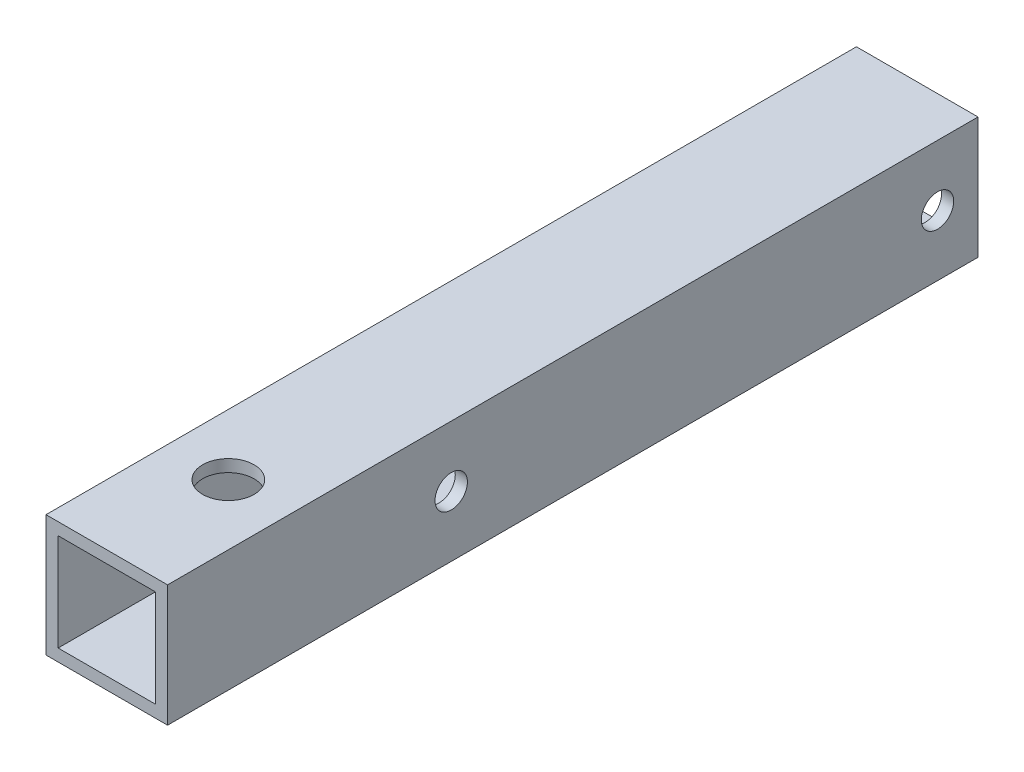
ISO-10303-21;
HEADER;
FILE_DESCRIPTION(('STEP AP214'),'2;1');
FILE_NAME('part.step','',(''),(''),'','','');
FILE_SCHEMA(('AUTOMOTIVE_DESIGN { 1 0 10303 214 1 1 1 1 }'));
ENDSEC;
DATA;
#1=APPLICATION_CONTEXT('core data for automotive mechanical design processes');
#2=APPLICATION_PROTOCOL_DEFINITION('international standard','automotive_design',2000,#1);
#3=PRODUCT_CONTEXT('',#1,'mechanical');
#4=PRODUCT('Part','Part','',(#3));
#5=PRODUCT_RELATED_PRODUCT_CATEGORY('part','',(#4));
#6=PRODUCT_DEFINITION_FORMATION('','',#4);
#7=PRODUCT_DEFINITION_CONTEXT('part definition',#1,'design');
#8=PRODUCT_DEFINITION('design','',#6,#7);
#9=PRODUCT_DEFINITION_SHAPE('','',#8);
#10=(LENGTH_UNIT() NAMED_UNIT(*) SI_UNIT(.MILLI.,.METRE.));
#11=(NAMED_UNIT(*) PLANE_ANGLE_UNIT() SI_UNIT($,.RADIAN.));
#12=(NAMED_UNIT(*) SI_UNIT($,.STERADIAN.) SOLID_ANGLE_UNIT());
#13=UNCERTAINTY_MEASURE_WITH_UNIT(LENGTH_MEASURE(1.E-05),#10,'distance_accuracy_value','');
#14=(GEOMETRIC_REPRESENTATION_CONTEXT(3) GLOBAL_UNCERTAINTY_ASSIGNED_CONTEXT((#13)) GLOBAL_UNIT_ASSIGNED_CONTEXT((#10,
#11,#12)) REPRESENTATION_CONTEXT('',''));
#15=CARTESIAN_POINT('',(0.,0.,0.));
#16=DIRECTION('',(0.,0.,1.));
#17=DIRECTION('',(1.,0.,0.));
#18=AXIS2_PLACEMENT_3D('',#15,#16,#17);
#19=CARTESIAN_POINT('',(0.,0.,100.));
#20=DIRECTION('',(0.,0.,1.));
#21=DIRECTION('',(1.,0.,0.));
#22=AXIS2_PLACEMENT_3D('',#19,#20,#21);
#23=PLANE('',#22);
#24=DIRECTION('',(0.,1.,0.));
#25=VECTOR('',#24,1.);
#26=CARTESIAN_POINT('',(7.5,7.5,100.));
#27=LINE('',#26,#25);
#28=CARTESIAN_POINT('',(7.5,-7.5,100.));
#29=VERTEX_POINT('',#28);
#30=CARTESIAN_POINT('',(7.5,7.5,100.));
#31=VERTEX_POINT('',#30);
#32=EDGE_CURVE('E164',#29,#31,#27,.T.);
#33=ORIENTED_EDGE('',*,*,#32,.T.);
#34=DIRECTION('',(-1.,0.,0.));
#35=VECTOR('',#34,1.);
#36=CARTESIAN_POINT('',(-7.5,7.5,100.));
#37=LINE('',#36,#35);
#38=CARTESIAN_POINT('',(-7.5,7.5,100.));
#39=VERTEX_POINT('',#38);
#40=EDGE_CURVE('E167',#31,#39,#37,.T.);
#41=ORIENTED_EDGE('',*,*,#40,.T.);
#42=DIRECTION('',(0.,-1.,0.));
#43=VECTOR('',#42,1.);
#44=CARTESIAN_POINT('',(-7.5,7.5,100.));
#45=LINE('',#44,#43);
#46=CARTESIAN_POINT('',(-7.5,-7.5,100.));
#47=VERTEX_POINT('',#46);
#48=EDGE_CURVE('E170',#39,#47,#45,.T.);
#49=ORIENTED_EDGE('',*,*,#48,.T.);
#50=DIRECTION('',(1.,0.,0.));
#51=VECTOR('',#50,1.);
#52=CARTESIAN_POINT('',(-7.5,-7.5,100.));
#53=LINE('',#52,#51);
#54=EDGE_CURVE('E172',#47,#29,#53,.T.);
#55=ORIENTED_EDGE('',*,*,#54,.T.);
#56=EDGE_LOOP('',(#33,#41,#49,#55));
#57=FACE_BOUND('',#56,.T.);
#58=DIRECTION('',(-1.,0.,0.));
#59=VECTOR('',#58,1.);
#60=CARTESIAN_POINT('',(-7.5,6.,100.));
#61=LINE('',#60,#59);
#62=CARTESIAN_POINT('',(6.,6.,100.));
#63=VERTEX_POINT('',#62);
#64=CARTESIAN_POINT('',(-6.,6.,100.));
#65=VERTEX_POINT('',#64);
#66=EDGE_CURVE('E134',#63,#65,#61,.T.);
#67=ORIENTED_EDGE('',*,*,#66,.F.);
#68=DIRECTION('',(0.,1.,0.));
#69=VECTOR('',#68,1.);
#70=CARTESIAN_POINT('',(6.,7.5,100.));
#71=LINE('',#70,#69);
#72=CARTESIAN_POINT('',(6.,-6.,100.));
#73=VERTEX_POINT('',#72);
#74=EDGE_CURVE('E126',#73,#63,#71,.T.);
#75=ORIENTED_EDGE('',*,*,#74,.F.);
#76=DIRECTION('',(1.,0.,0.));
#77=VECTOR('',#76,1.);
#78=CARTESIAN_POINT('',(-7.5,-6.,100.));
#79=LINE('',#78,#77);
#80=CARTESIAN_POINT('',(-6.,-6.,100.));
#81=VERTEX_POINT('',#80);
#82=EDGE_CURVE('E148',#81,#73,#79,.T.);
#83=ORIENTED_EDGE('',*,*,#82,.F.);
#84=DIRECTION('',(0.,-1.,0.));
#85=VECTOR('',#84,1.);
#86=CARTESIAN_POINT('',(-6.,7.5,100.));
#87=LINE('',#86,#85);
#88=EDGE_CURVE('E146',#65,#81,#87,.T.);
#89=ORIENTED_EDGE('',*,*,#88,.F.);
#90=EDGE_LOOP('',(#67,#75,#83,#89));
#91=FACE_BOUND('',#90,.T.);
#92=ADVANCED_FACE('F59',(#57,#91),#23,.T.);
#93=CARTESIAN_POINT('',(0.,0.,0.));
#94=DIRECTION('',(0.,0.,1.));
#95=DIRECTION('',(1.,0.,0.));
#96=AXIS2_PLACEMENT_3D('',#93,#94,#95);
#97=PLANE('',#96);
#98=DIRECTION('',(0.,1.,0.));
#99=VECTOR('',#98,1.);
#100=CARTESIAN_POINT('',(7.5,7.5,0.));
#101=LINE('',#100,#99);
#102=CARTESIAN_POINT('',(7.5,-7.5,0.));
#103=VERTEX_POINT('',#102);
#104=CARTESIAN_POINT('',(7.5,7.5,0.));
#105=VERTEX_POINT('',#104);
#106=EDGE_CURVE('E142',#103,#105,#101,.T.);
#107=ORIENTED_EDGE('',*,*,#106,.F.);
#108=DIRECTION('',(1.,0.,0.));
#109=VECTOR('',#108,1.);
#110=CARTESIAN_POINT('',(-7.5,-7.5,0.));
#111=LINE('',#110,#109);
#112=CARTESIAN_POINT('',(-7.5,-7.5,0.));
#113=VERTEX_POINT('',#112);
#114=EDGE_CURVE('E168',#113,#103,#111,.T.);
#115=ORIENTED_EDGE('',*,*,#114,.F.);
#116=DIRECTION('',(0.,-1.,0.));
#117=VECTOR('',#116,1.);
#118=CARTESIAN_POINT('',(-7.5,7.5,0.));
#119=LINE('',#118,#117);
#120=CARTESIAN_POINT('',(-7.5,7.5,0.));
#121=VERTEX_POINT('',#120);
#122=EDGE_CURVE('E179',#121,#113,#119,.T.);
#123=ORIENTED_EDGE('',*,*,#122,.F.);
#124=DIRECTION('',(-1.,0.,0.));
#125=VECTOR('',#124,1.);
#126=CARTESIAN_POINT('',(-7.5,7.5,0.));
#127=LINE('',#126,#125);
#128=EDGE_CURVE('E177',#105,#121,#127,.T.);
#129=ORIENTED_EDGE('',*,*,#128,.F.);
#130=EDGE_LOOP('',(#107,#115,#123,#129));
#131=FACE_BOUND('',#130,.T.);
#132=DIRECTION('',(0.,1.,0.));
#133=VECTOR('',#132,1.);
#134=CARTESIAN_POINT('',(6.,7.5,0.));
#135=LINE('',#134,#133);
#136=CARTESIAN_POINT('',(6.,-6.,0.));
#137=VERTEX_POINT('',#136);
#138=CARTESIAN_POINT('',(6.,6.,0.));
#139=VERTEX_POINT('',#138);
#140=EDGE_CURVE('E84',#137,#139,#135,.T.);
#141=ORIENTED_EDGE('',*,*,#140,.T.);
#142=DIRECTION('',(-1.,0.,0.));
#143=VECTOR('',#142,1.);
#144=CARTESIAN_POINT('',(-7.5,6.,0.));
#145=LINE('',#144,#143);
#146=CARTESIAN_POINT('',(-6.,6.,0.));
#147=VERTEX_POINT('',#146);
#148=EDGE_CURVE('E141',#139,#147,#145,.T.);
#149=ORIENTED_EDGE('',*,*,#148,.T.);
#150=DIRECTION('',(0.,-1.,0.));
#151=VECTOR('',#150,1.);
#152=CARTESIAN_POINT('',(-6.,7.5,0.));
#153=LINE('',#152,#151);
#154=CARTESIAN_POINT('',(-6.,-6.,0.));
#155=VERTEX_POINT('',#154);
#156=EDGE_CURVE('E156',#147,#155,#153,.T.);
#157=ORIENTED_EDGE('',*,*,#156,.T.);
#158=DIRECTION('',(1.,0.,0.));
#159=VECTOR('',#158,1.);
#160=CARTESIAN_POINT('',(-7.5,-6.,0.));
#161=LINE('',#160,#159);
#162=EDGE_CURVE('E135',#155,#137,#161,.T.);
#163=ORIENTED_EDGE('',*,*,#162,.T.);
#164=EDGE_LOOP('',(#141,#149,#157,#163));
#165=FACE_BOUND('',#164,.T.);
#166=ADVANCED_FACE('F237',(#131,#165),#97,.F.);
#167=CARTESIAN_POINT('',(7.5,7.5,100.));
#168=DIRECTION('',(-1.,0.,0.));
#169=DIRECTION('',(0.,-1.,0.));
#170=AXIS2_PLACEMENT_3D('',#167,#168,#169);
#171=PLANE('',#170);
#172=CARTESIAN_POINT('',(7.5,0.,5.));
#173=DIRECTION('',(1.,0.,0.));
#174=DIRECTION('',(0.,1.,0.));
#175=AXIS2_PLACEMENT_3D('',#172,#173,#174);
#176=CIRCLE('',#175,2.);
#177=CARTESIAN_POINT('',(7.5,2.,5.));
#178=VERTEX_POINT('',#177);
#179=EDGE_CURVE('E210',#178,#178,#176,.T.);
#180=ORIENTED_EDGE('',*,*,#179,.F.);
#181=EDGE_LOOP('',(#180));
#182=FACE_BOUND('',#181,.T.);
#183=CARTESIAN_POINT('',(7.5,0.,65.));
#184=DIRECTION('',(1.,0.,0.));
#185=DIRECTION('',(0.,1.,0.));
#186=AXIS2_PLACEMENT_3D('',#183,#184,#185);
#187=CIRCLE('',#186,2.);
#188=CARTESIAN_POINT('',(7.5,1.99999999999999,65.));
#189=VERTEX_POINT('',#188);
#190=EDGE_CURVE('E203',#189,#189,#187,.T.);
#191=ORIENTED_EDGE('',*,*,#190,.F.);
#192=EDGE_LOOP('',(#191));
#193=FACE_BOUND('',#192,.T.);
#194=ORIENTED_EDGE('',*,*,#106,.T.);
#195=DIRECTION('',(0.,0.,-1.));
#196=VECTOR('',#195,1.);
#197=CARTESIAN_POINT('',(7.5,7.5,100.));
#198=LINE('',#197,#196);
#199=EDGE_CURVE('E12',#31,#105,#198,.T.);
#200=ORIENTED_EDGE('',*,*,#199,.F.);
#201=ORIENTED_EDGE('',*,*,#32,.F.);
#202=DIRECTION('',(0.,0.,-1.));
#203=VECTOR('',#202,1.);
#204=CARTESIAN_POINT('',(7.5,-7.5,100.));
#205=LINE('',#204,#203);
#206=EDGE_CURVE('E174',#29,#103,#205,.T.);
#207=ORIENTED_EDGE('',*,*,#206,.T.);
#208=EDGE_LOOP('',(#194,#200,#201,#207));
#209=FACE_BOUND('',#208,.T.);
#210=ADVANCED_FACE('F61',(#182,#193,#209),#171,.F.);
#211=CARTESIAN_POINT('',(-7.5,7.5,100.));
#212=DIRECTION('',(0.,-1.,0.));
#213=DIRECTION('',(1.,0.,0.));
#214=AXIS2_PLACEMENT_3D('',#211,#212,#213);
#215=PLANE('',#214);
#216=CARTESIAN_POINT('',(0.,7.5,85.));
#217=DIRECTION('',(0.,1.,0.));
#218=DIRECTION('',(-1.,0.,0.));
#219=AXIS2_PLACEMENT_3D('',#216,#217,#218);
#220=CIRCLE('',#219,3.175);
#221=CARTESIAN_POINT('',(-3.175,7.5,85.));
#222=VERTEX_POINT('',#221);
#223=EDGE_CURVE('E217',#222,#222,#220,.T.);
#224=ORIENTED_EDGE('',*,*,#223,.F.);
#225=EDGE_LOOP('',(#224));
#226=FACE_BOUND('',#225,.T.);
#227=ORIENTED_EDGE('',*,*,#128,.T.);
#228=DIRECTION('',(0.,0.,-1.));
#229=VECTOR('',#228,1.);
#230=CARTESIAN_POINT('',(-7.5,7.5,100.));
#231=LINE('',#230,#229);
#232=EDGE_CURVE('E68',#39,#121,#231,.T.);
#233=ORIENTED_EDGE('',*,*,#232,.F.);
#234=ORIENTED_EDGE('',*,*,#40,.F.);
#235=ORIENTED_EDGE('',*,*,#199,.T.);
#236=EDGE_LOOP('',(#227,#233,#234,#235));
#237=FACE_BOUND('',#236,.T.);
#238=ADVANCED_FACE('F263',(#226,#237),#215,.F.);
#239=CARTESIAN_POINT('',(-7.5,7.5,100.));
#240=DIRECTION('',(1.,0.,0.));
#241=DIRECTION('',(0.,1.,0.));
#242=AXIS2_PLACEMENT_3D('',#239,#240,#241);
#243=PLANE('',#242);
#244=CARTESIAN_POINT('',(-7.50000000000001,0.,5.));
#245=DIRECTION('',(1.,0.,0.));
#246=DIRECTION('',(0.,1.,0.));
#247=AXIS2_PLACEMENT_3D('',#244,#245,#246);
#248=CIRCLE('',#247,2.);
#249=CARTESIAN_POINT('',(-7.50000000000001,2.,5.));
#250=VERTEX_POINT('',#249);
#251=EDGE_CURVE('E192',#250,#250,#248,.T.);
#252=ORIENTED_EDGE('',*,*,#251,.T.);
#253=EDGE_LOOP('',(#252));
#254=FACE_BOUND('',#253,.T.);
#255=CARTESIAN_POINT('',(-7.50000000000001,0.,65.));
#256=DIRECTION('',(1.,0.,0.));
#257=DIRECTION('',(0.,1.,0.));
#258=AXIS2_PLACEMENT_3D('',#255,#256,#257);
#259=CIRCLE('',#258,2.);
#260=CARTESIAN_POINT('',(-7.50000000000001,1.99999999999999,65.));
#261=VERTEX_POINT('',#260);
#262=EDGE_CURVE('E206',#261,#261,#259,.T.);
#263=ORIENTED_EDGE('',*,*,#262,.T.);
#264=EDGE_LOOP('',(#263));
#265=FACE_BOUND('',#264,.T.);
#266=ORIENTED_EDGE('',*,*,#122,.T.);
#267=DIRECTION('',(0.,0.,-1.));
#268=VECTOR('',#267,1.);
#269=CARTESIAN_POINT('',(-7.5,-7.5,100.));
#270=LINE('',#269,#268);
#271=EDGE_CURVE('E184',#47,#113,#270,.T.);
#272=ORIENTED_EDGE('',*,*,#271,.F.);
#273=ORIENTED_EDGE('',*,*,#48,.F.);
#274=ORIENTED_EDGE('',*,*,#232,.T.);
#275=EDGE_LOOP('',(#266,#272,#273,#274));
#276=FACE_BOUND('',#275,.T.);
#277=ADVANCED_FACE('F261',(#254,#265,#276),#243,.F.);
#278=CARTESIAN_POINT('',(-7.5,-7.5,100.));
#279=DIRECTION('',(0.,1.,0.));
#280=DIRECTION('',(0.,0.,1.));
#281=AXIS2_PLACEMENT_3D('',#278,#279,#280);
#282=PLANE('',#281);
#283=CARTESIAN_POINT('',(0.,-7.5,85.));
#284=DIRECTION('',(0.,1.,0.));
#285=DIRECTION('',(-1.,0.,0.));
#286=AXIS2_PLACEMENT_3D('',#283,#284,#285);
#287=CIRCLE('',#286,3.175);
#288=CARTESIAN_POINT('',(-3.175,-7.5,85.));
#289=VERTEX_POINT('',#288);
#290=EDGE_CURVE('E220',#289,#289,#287,.T.);
#291=ORIENTED_EDGE('',*,*,#290,.T.);
#292=EDGE_LOOP('',(#291));
#293=FACE_BOUND('',#292,.T.);
#294=ORIENTED_EDGE('',*,*,#114,.T.);
#295=ORIENTED_EDGE('',*,*,#206,.F.);
#296=ORIENTED_EDGE('',*,*,#54,.F.);
#297=ORIENTED_EDGE('',*,*,#271,.T.);
#298=EDGE_LOOP('',(#294,#295,#296,#297));
#299=FACE_BOUND('',#298,.T.);
#300=ADVANCED_FACE('F258',(#293,#299),#282,.F.);
#301=CARTESIAN_POINT('',(6.,7.5,100.));
#302=DIRECTION('',(-1.,0.,0.));
#303=DIRECTION('',(0.,-1.,0.));
#304=AXIS2_PLACEMENT_3D('',#301,#302,#303);
#305=PLANE('',#304);
#306=CARTESIAN_POINT('',(6.,0.,5.));
#307=DIRECTION('',(-1.,0.,0.));
#308=DIRECTION('',(0.,-1.,0.));
#309=AXIS2_PLACEMENT_3D('',#306,#307,#308);
#310=CIRCLE('',#309,2.);
#311=CARTESIAN_POINT('',(6.,-2.,5.));
#312=VERTEX_POINT('',#311);
#313=EDGE_CURVE('E154',#312,#312,#310,.T.);
#314=ORIENTED_EDGE('',*,*,#313,.F.);
#315=EDGE_LOOP('',(#314));
#316=FACE_BOUND('',#315,.T.);
#317=CARTESIAN_POINT('',(6.,0.,65.));
#318=DIRECTION('',(-1.,0.,0.));
#319=DIRECTION('',(0.,-1.,0.));
#320=AXIS2_PLACEMENT_3D('',#317,#318,#319);
#321=CIRCLE('',#320,2.);
#322=CARTESIAN_POINT('',(6.,-2.,65.));
#323=VERTEX_POINT('',#322);
#324=EDGE_CURVE('E191',#323,#323,#321,.T.);
#325=ORIENTED_EDGE('',*,*,#324,.F.);
#326=EDGE_LOOP('',(#325));
#327=FACE_BOUND('',#326,.T.);
#328=ORIENTED_EDGE('',*,*,#140,.F.);
#329=DIRECTION('',(0.,0.,-1.));
#330=VECTOR('',#329,1.);
#331=CARTESIAN_POINT('',(6.,-6.,100.));
#332=LINE('',#331,#330);
#333=EDGE_CURVE('E130',#73,#137,#332,.T.);
#334=ORIENTED_EDGE('',*,*,#333,.F.);
#335=ORIENTED_EDGE('',*,*,#74,.T.);
#336=DIRECTION('',(0.,0.,-1.));
#337=VECTOR('',#336,1.);
#338=CARTESIAN_POINT('',(6.,6.,100.));
#339=LINE('',#338,#337);
#340=EDGE_CURVE('E129',#63,#139,#339,.T.);
#341=ORIENTED_EDGE('',*,*,#340,.T.);
#342=EDGE_LOOP('',(#328,#334,#335,#341));
#343=FACE_BOUND('',#342,.T.);
#344=ADVANCED_FACE('F128',(#316,#327,#343),#305,.T.);
#345=CARTESIAN_POINT('',(-7.5,6.,100.));
#346=DIRECTION('',(0.,-1.,0.));
#347=DIRECTION('',(1.,0.,0.));
#348=AXIS2_PLACEMENT_3D('',#345,#346,#347);
#349=PLANE('',#348);
#350=CARTESIAN_POINT('',(0.,6.,85.));
#351=DIRECTION('',(0.,-1.,0.));
#352=DIRECTION('',(1.,0.,0.));
#353=AXIS2_PLACEMENT_3D('',#350,#351,#352);
#354=CIRCLE('',#353,3.175);
#355=CARTESIAN_POINT('',(3.175,6.,85.));
#356=VERTEX_POINT('',#355);
#357=EDGE_CURVE('E207',#356,#356,#354,.T.);
#358=ORIENTED_EDGE('',*,*,#357,.F.);
#359=EDGE_LOOP('',(#358));
#360=FACE_BOUND('',#359,.T.);
#361=ORIENTED_EDGE('',*,*,#148,.F.);
#362=ORIENTED_EDGE('',*,*,#340,.F.);
#363=ORIENTED_EDGE('',*,*,#66,.T.);
#364=DIRECTION('',(0.,0.,-1.));
#365=VECTOR('',#364,1.);
#366=CARTESIAN_POINT('',(-6.,6.,100.));
#367=LINE('',#366,#365);
#368=EDGE_CURVE('E143',#65,#147,#367,.T.);
#369=ORIENTED_EDGE('',*,*,#368,.T.);
#370=EDGE_LOOP('',(#361,#362,#363,#369));
#371=FACE_BOUND('',#370,.T.);
#372=ADVANCED_FACE('F138',(#360,#371),#349,.T.);
#373=CARTESIAN_POINT('',(-6.,7.5,100.));
#374=DIRECTION('',(1.,0.,0.));
#375=DIRECTION('',(0.,1.,0.));
#376=AXIS2_PLACEMENT_3D('',#373,#374,#375);
#377=PLANE('',#376);
#378=CARTESIAN_POINT('',(-6.,0.,5.));
#379=DIRECTION('',(1.,0.,0.));
#380=DIRECTION('',(0.,1.,0.));
#381=AXIS2_PLACEMENT_3D('',#378,#379,#380);
#382=CIRCLE('',#381,2.);
#383=CARTESIAN_POINT('',(-6.,2.,5.));
#384=VERTEX_POINT('',#383);
#385=EDGE_CURVE('E193',#384,#384,#382,.T.);
#386=ORIENTED_EDGE('',*,*,#385,.F.);
#387=EDGE_LOOP('',(#386));
#388=FACE_BOUND('',#387,.T.);
#389=CARTESIAN_POINT('',(-6.,0.,65.));
#390=DIRECTION('',(1.,0.,0.));
#391=DIRECTION('',(0.,1.,0.));
#392=AXIS2_PLACEMENT_3D('',#389,#390,#391);
#393=CIRCLE('',#392,2.);
#394=CARTESIAN_POINT('',(-6.,1.99999999999999,65.));
#395=VERTEX_POINT('',#394);
#396=EDGE_CURVE('E189',#395,#395,#393,.T.);
#397=ORIENTED_EDGE('',*,*,#396,.F.);
#398=EDGE_LOOP('',(#397));
#399=FACE_BOUND('',#398,.T.);
#400=ORIENTED_EDGE('',*,*,#156,.F.);
#401=ORIENTED_EDGE('',*,*,#368,.F.);
#402=ORIENTED_EDGE('',*,*,#88,.T.);
#403=DIRECTION('',(0.,0.,-1.));
#404=VECTOR('',#403,1.);
#405=CARTESIAN_POINT('',(-6.,-6.,100.));
#406=LINE('',#405,#404);
#407=EDGE_CURVE('E76',#81,#155,#406,.T.);
#408=ORIENTED_EDGE('',*,*,#407,.T.);
#409=EDGE_LOOP('',(#400,#401,#402,#408));
#410=FACE_BOUND('',#409,.T.);
#411=ADVANCED_FACE('F233',(#388,#399,#410),#377,.T.);
#412=CARTESIAN_POINT('',(-7.5,-6.,100.));
#413=DIRECTION('',(0.,1.,0.));
#414=DIRECTION('',(0.,0.,1.));
#415=AXIS2_PLACEMENT_3D('',#412,#413,#414);
#416=PLANE('',#415);
#417=CARTESIAN_POINT('',(0.,-6.,85.));
#418=DIRECTION('',(0.,1.,0.));
#419=DIRECTION('',(0.,0.,1.));
#420=AXIS2_PLACEMENT_3D('',#417,#418,#419);
#421=CIRCLE('',#420,3.175);
#422=CARTESIAN_POINT('',(0.,-6.,88.175));
#423=VERTEX_POINT('',#422);
#424=EDGE_CURVE('E63',#423,#423,#421,.T.);
#425=ORIENTED_EDGE('',*,*,#424,.F.);
#426=EDGE_LOOP('',(#425));
#427=FACE_BOUND('',#426,.T.);
#428=ORIENTED_EDGE('',*,*,#162,.F.);
#429=ORIENTED_EDGE('',*,*,#407,.F.);
#430=ORIENTED_EDGE('',*,*,#82,.T.);
#431=ORIENTED_EDGE('',*,*,#333,.T.);
#432=EDGE_LOOP('',(#428,#429,#430,#431));
#433=FACE_BOUND('',#432,.T.);
#434=ADVANCED_FACE('F230',(#427,#433),#416,.T.);
#435=CARTESIAN_POINT('',(-7.50000000000001,0.,65.));
#436=DIRECTION('',(1.,0.,0.));
#437=DIRECTION('',(0.,1.,0.));
#438=AXIS2_PLACEMENT_3D('',#435,#436,#437);
#439=CYLINDRICAL_SURFACE('',#438,2.);
#440=ORIENTED_EDGE('',*,*,#396,.T.);
#441=EDGE_LOOP('',(#440));
#442=FACE_BOUND('',#441,.T.);
#443=ORIENTED_EDGE('',*,*,#262,.F.);
#444=EDGE_LOOP('',(#443));
#445=FACE_BOUND('',#444,.T.);
#446=ADVANCED_FACE('F232',(#442,#445),#439,.F.);
#447=CARTESIAN_POINT('',(-7.50000000000001,0.,5.));
#448=DIRECTION('',(1.,0.,0.));
#449=DIRECTION('',(0.,1.,0.));
#450=AXIS2_PLACEMENT_3D('',#447,#448,#449);
#451=CYLINDRICAL_SURFACE('',#450,2.);
#452=ORIENTED_EDGE('',*,*,#385,.T.);
#453=EDGE_LOOP('',(#452));
#454=FACE_BOUND('',#453,.T.);
#455=ORIENTED_EDGE('',*,*,#251,.F.);
#456=EDGE_LOOP('',(#455));
#457=FACE_BOUND('',#456,.T.);
#458=ADVANCED_FACE('F296',(#454,#457),#451,.F.);
#459=ORIENTED_EDGE('',*,*,#324,.T.);
#460=EDGE_LOOP('',(#459));
#461=FACE_BOUND('',#460,.T.);
#462=ORIENTED_EDGE('',*,*,#190,.T.);
#463=EDGE_LOOP('',(#462));
#464=FACE_BOUND('',#463,.T.);
#465=ADVANCED_FACE('F299',(#461,#464),#439,.F.);
#466=ORIENTED_EDGE('',*,*,#313,.T.);
#467=EDGE_LOOP('',(#466));
#468=FACE_BOUND('',#467,.T.);
#469=ORIENTED_EDGE('',*,*,#179,.T.);
#470=EDGE_LOOP('',(#469));
#471=FACE_BOUND('',#470,.T.);
#472=ADVANCED_FACE('F294',(#468,#471),#451,.F.);
#473=CARTESIAN_POINT('',(0.,-7.5,85.));
#474=DIRECTION('',(0.,1.,0.));
#475=DIRECTION('',(-1.,0.,0.));
#476=AXIS2_PLACEMENT_3D('',#473,#474,#475);
#477=CYLINDRICAL_SURFACE('',#476,3.175);
#478=ORIENTED_EDGE('',*,*,#424,.T.);
#479=EDGE_LOOP('',(#478));
#480=FACE_BOUND('',#479,.T.);
#481=ORIENTED_EDGE('',*,*,#290,.F.);
#482=EDGE_LOOP('',(#481));
#483=FACE_BOUND('',#482,.T.);
#484=ADVANCED_FACE('F227',(#480,#483),#477,.F.);
#485=ORIENTED_EDGE('',*,*,#357,.T.);
#486=EDGE_LOOP('',(#485));
#487=FACE_BOUND('',#486,.T.);
#488=ORIENTED_EDGE('',*,*,#223,.T.);
#489=EDGE_LOOP('',(#488));
#490=FACE_BOUND('',#489,.T.);
#491=ADVANCED_FACE('F287',(#487,#490),#477,.F.);
#492=CLOSED_SHELL('',(#92,#166,#210,#238,#277,#300,#344,#372,#411,#434,#446,#458,#465,#472,#484,#491));
#493=MANIFOLD_SOLID_BREP('B2',#492);
#494=ADVANCED_BREP_SHAPE_REPRESENTATION('',(#18,#493),#14);
#495=SHAPE_DEFINITION_REPRESENTATION(#9,#494);
ENDSEC;
END-ISO-10303-21;
